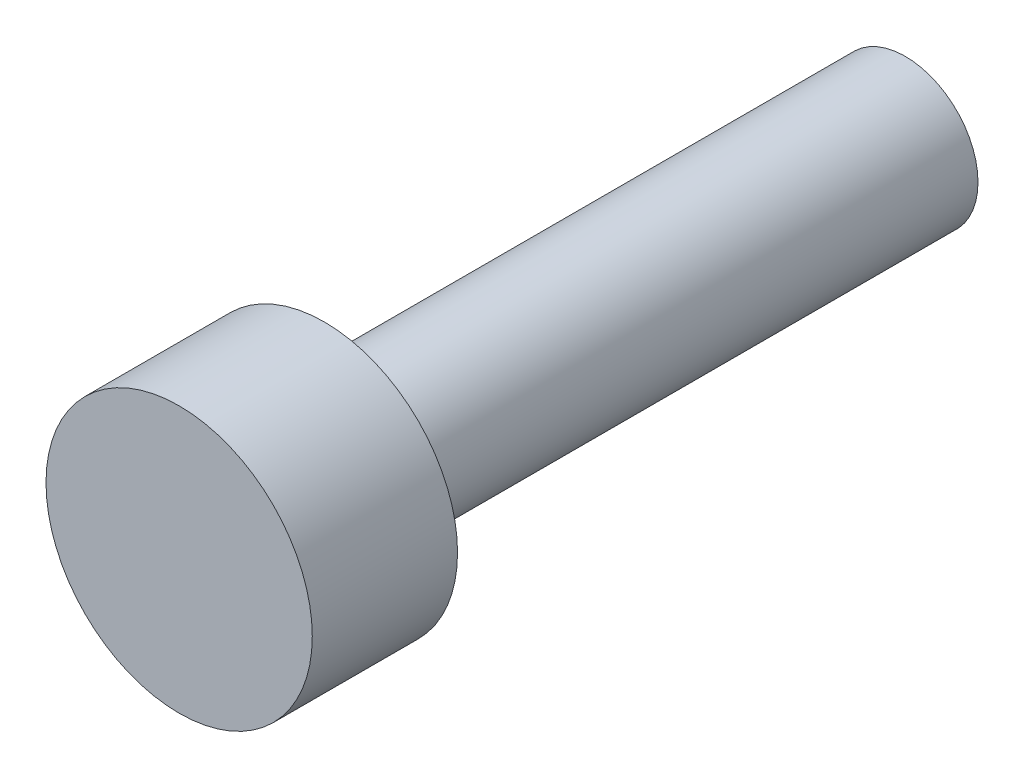
ISO-10303-21;
HEADER;
FILE_DESCRIPTION(('STEP AP214'),'2;1');
FILE_NAME('part.step','',(''),(''),'','','');
FILE_SCHEMA(('AUTOMOTIVE_DESIGN { 1 0 10303 214 1 1 1 1 }'));
ENDSEC;
DATA;
#1=APPLICATION_CONTEXT('core data for automotive mechanical design processes');
#2=APPLICATION_PROTOCOL_DEFINITION('international standard','automotive_design',2000,#1);
#3=PRODUCT_CONTEXT('',#1,'mechanical');
#4=PRODUCT('Part','Part','',(#3));
#5=PRODUCT_RELATED_PRODUCT_CATEGORY('part','',(#4));
#6=PRODUCT_DEFINITION_FORMATION('','',#4);
#7=PRODUCT_DEFINITION_CONTEXT('part definition',#1,'design');
#8=PRODUCT_DEFINITION('design','',#6,#7);
#9=PRODUCT_DEFINITION_SHAPE('','',#8);
#10=(LENGTH_UNIT() NAMED_UNIT(*) SI_UNIT(.MILLI.,.METRE.));
#11=(NAMED_UNIT(*) PLANE_ANGLE_UNIT() SI_UNIT($,.RADIAN.));
#12=(NAMED_UNIT(*) SI_UNIT($,.STERADIAN.) SOLID_ANGLE_UNIT());
#13=UNCERTAINTY_MEASURE_WITH_UNIT(LENGTH_MEASURE(1.E-05),#10,'distance_accuracy_value','');
#14=(GEOMETRIC_REPRESENTATION_CONTEXT(3) GLOBAL_UNCERTAINTY_ASSIGNED_CONTEXT((#13)) GLOBAL_UNIT_ASSIGNED_CONTEXT((#10,
#11,#12)) REPRESENTATION_CONTEXT('',''));
#15=CARTESIAN_POINT('',(0.,0.,0.));
#16=DIRECTION('',(0.,0.,1.));
#17=DIRECTION('',(1.,0.,0.));
#18=AXIS2_PLACEMENT_3D('',#15,#16,#17);
#19=CARTESIAN_POINT('',(0.,0.,0.));
#20=DIRECTION('',(0.,0.,-1.));
#21=DIRECTION('',(-1.,0.,0.));
#22=AXIS2_PLACEMENT_3D('',#19,#20,#21);
#23=CYLINDRICAL_SURFACE('',#22,1.5);
#24=CARTESIAN_POINT('',(0.,0.,0.));
#25=DIRECTION('',(0.,0.,1.));
#26=DIRECTION('',(1.,0.,0.));
#27=AXIS2_PLACEMENT_3D('',#24,#25,#26);
#28=CIRCLE('',#27,1.5);
#29=CARTESIAN_POINT('',(1.5,0.,0.));
#30=VERTEX_POINT('',#29);
#31=EDGE_CURVE('E10',#30,#30,#28,.T.);
#32=ORIENTED_EDGE('',*,*,#31,.F.);
#33=EDGE_LOOP('',(#32));
#34=FACE_BOUND('',#33,.T.);
#35=CARTESIAN_POINT('',(0.,0.,-12.));
#36=DIRECTION('',(0.,0.,1.));
#37=DIRECTION('',(1.,0.,0.));
#38=AXIS2_PLACEMENT_3D('',#35,#36,#37);
#39=CIRCLE('',#38,1.5);
#40=CARTESIAN_POINT('',(1.5,0.,-12.));
#41=VERTEX_POINT('',#40);
#42=EDGE_CURVE('E44',#41,#41,#39,.T.);
#43=ORIENTED_EDGE('',*,*,#42,.T.);
#44=EDGE_LOOP('',(#43));
#45=FACE_BOUND('',#44,.T.);
#46=ADVANCED_FACE('F41',(#34,#45),#23,.T.);
#47=CARTESIAN_POINT('',(0.,0.,-12.));
#48=DIRECTION('',(0.,0.,1.));
#49=DIRECTION('',(1.,0.,0.));
#50=AXIS2_PLACEMENT_3D('',#47,#48,#49);
#51=PLANE('',#50);
#52=ORIENTED_EDGE('',*,*,#42,.F.);
#53=EDGE_LOOP('',(#52));
#54=FACE_BOUND('',#53,.T.);
#55=ADVANCED_FACE('F64',(#54),#51,.F.);
#56=CARTESIAN_POINT('',(0.,0.,3.));
#57=DIRECTION('',(0.,0.,-1.));
#58=DIRECTION('',(-1.,0.,0.));
#59=AXIS2_PLACEMENT_3D('',#56,#57,#58);
#60=CYLINDRICAL_SURFACE('',#59,2.75);
#61=CARTESIAN_POINT('',(0.,0.,3.));
#62=DIRECTION('',(0.,0.,1.));
#63=DIRECTION('',(1.,0.,0.));
#64=AXIS2_PLACEMENT_3D('',#61,#62,#63);
#65=CIRCLE('',#64,2.75);
#66=CARTESIAN_POINT('',(2.75,0.,3.));
#67=VERTEX_POINT('',#66);
#68=EDGE_CURVE('E51',#67,#67,#65,.T.);
#69=ORIENTED_EDGE('',*,*,#68,.F.);
#70=EDGE_LOOP('',(#69));
#71=FACE_BOUND('',#70,.T.);
#72=CARTESIAN_POINT('',(0.,0.,0.));
#73=DIRECTION('',(0.,0.,1.));
#74=DIRECTION('',(1.,0.,0.));
#75=AXIS2_PLACEMENT_3D('',#72,#73,#74);
#76=CIRCLE('',#75,2.75);
#77=CARTESIAN_POINT('',(2.75,0.,0.));
#78=VERTEX_POINT('',#77);
#79=EDGE_CURVE('E53',#78,#78,#76,.T.);
#80=ORIENTED_EDGE('',*,*,#79,.T.);
#81=EDGE_LOOP('',(#80));
#82=FACE_BOUND('',#81,.T.);
#83=ADVANCED_FACE('F61',(#71,#82),#60,.T.);
#84=CARTESIAN_POINT('',(0.,0.,3.));
#85=DIRECTION('',(0.,0.,1.));
#86=DIRECTION('',(1.,0.,0.));
#87=AXIS2_PLACEMENT_3D('',#84,#85,#86);
#88=PLANE('',#87);
#89=ORIENTED_EDGE('',*,*,#68,.T.);
#90=EDGE_LOOP('',(#89));
#91=FACE_BOUND('',#90,.T.);
#92=ADVANCED_FACE('F59',(#91),#88,.T.);
#93=CARTESIAN_POINT('',(0.,0.,0.));
#94=DIRECTION('',(0.,0.,1.));
#95=DIRECTION('',(1.,0.,0.));
#96=AXIS2_PLACEMENT_3D('',#93,#94,#95);
#97=PLANE('',#96);
#98=ORIENTED_EDGE('',*,*,#31,.T.);
#99=EDGE_LOOP('',(#98));
#100=FACE_BOUND('',#99,.T.);
#101=ORIENTED_EDGE('',*,*,#79,.F.);
#102=EDGE_LOOP('',(#101));
#103=FACE_BOUND('',#102,.T.);
#104=ADVANCED_FACE('F68',(#100,#103),#97,.F.);
#105=CLOSED_SHELL('',(#46,#55,#83,#92,#104));
#106=MANIFOLD_SOLID_BREP('B2',#105);
#107=ADVANCED_BREP_SHAPE_REPRESENTATION('',(#18,#106),#14);
#108=SHAPE_DEFINITION_REPRESENTATION(#9,#107);
ENDSEC;
END-ISO-10303-21;
